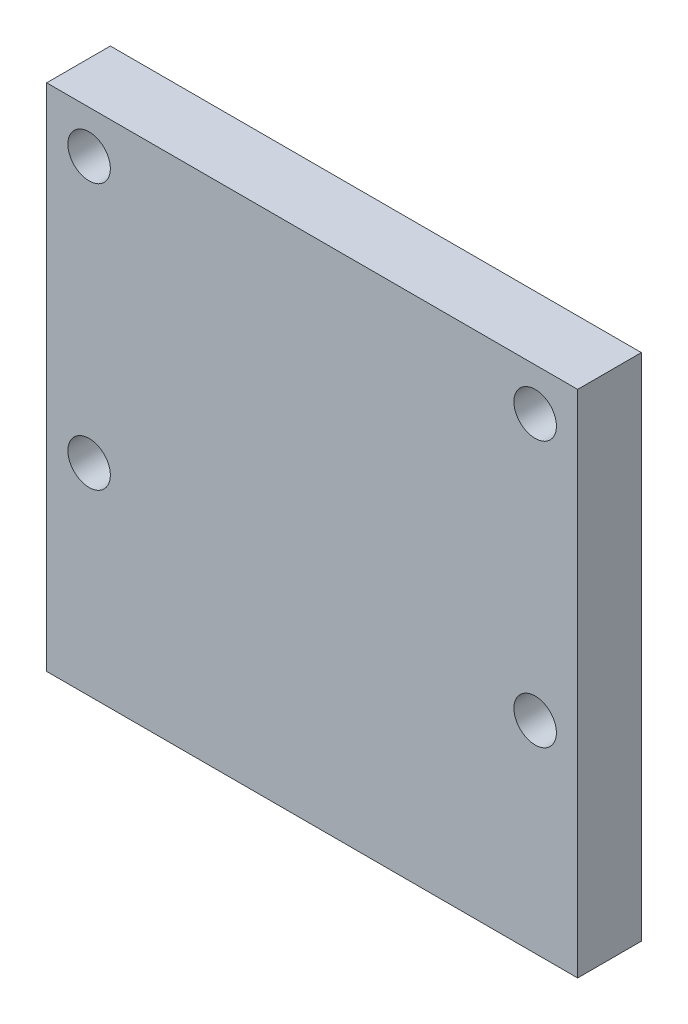
ISO-10303-21;
HEADER;
FILE_DESCRIPTION(('STEP AP214'),'2;1');
FILE_NAME('part.step','',(''),(''),'','','');
FILE_SCHEMA(('AUTOMOTIVE_DESIGN { 1 0 10303 214 1 1 1 1 }'));
ENDSEC;
DATA;
#1=APPLICATION_CONTEXT('core data for automotive mechanical design processes');
#2=APPLICATION_PROTOCOL_DEFINITION('international standard','automotive_design',2000,#1);
#3=PRODUCT_CONTEXT('',#1,'mechanical');
#4=PRODUCT('Part','Part','',(#3));
#5=PRODUCT_RELATED_PRODUCT_CATEGORY('part','',(#4));
#6=PRODUCT_DEFINITION_FORMATION('','',#4);
#7=PRODUCT_DEFINITION_CONTEXT('part definition',#1,'design');
#8=PRODUCT_DEFINITION('design','',#6,#7);
#9=PRODUCT_DEFINITION_SHAPE('','',#8);
#10=(LENGTH_UNIT() NAMED_UNIT(*) SI_UNIT(.MILLI.,.METRE.));
#11=(NAMED_UNIT(*) PLANE_ANGLE_UNIT() SI_UNIT($,.RADIAN.));
#12=(NAMED_UNIT(*) SI_UNIT($,.STERADIAN.) SOLID_ANGLE_UNIT());
#13=UNCERTAINTY_MEASURE_WITH_UNIT(LENGTH_MEASURE(1.E-05),#10,'distance_accuracy_value','');
#14=(GEOMETRIC_REPRESENTATION_CONTEXT(3) GLOBAL_UNCERTAINTY_ASSIGNED_CONTEXT((#13)) GLOBAL_UNIT_ASSIGNED_CONTEXT((#10,
#11,#12)) REPRESENTATION_CONTEXT('',''));
#15=CARTESIAN_POINT('',(0.,0.,0.));
#16=DIRECTION('',(0.,0.,1.));
#17=DIRECTION('',(1.,0.,0.));
#18=AXIS2_PLACEMENT_3D('',#15,#16,#17);
#19=CARTESIAN_POINT('',(-14.3954378335496,12.3161561050561,3.));
#20=DIRECTION('',(1.,0.,0.));
#21=DIRECTION('',(0.,0.,-1.));
#22=AXIS2_PLACEMENT_3D('',#19,#20,#21);
#23=PLANE('',#22);
#24=DIRECTION('',(0.,-1.,0.));
#25=VECTOR('',#24,1.);
#26=CARTESIAN_POINT('',(-14.3954378335496,12.3161561050561,0.));
#27=LINE('',#26,#25);
#28=CARTESIAN_POINT('',(-14.3954378335496,12.3161561050561,0.));
#29=VERTEX_POINT('',#28);
#30=CARTESIAN_POINT('',(-14.3954378335496,-11.6838438949439,0.));
#31=VERTEX_POINT('',#30);
#32=EDGE_CURVE('E107',#29,#31,#27,.T.);
#33=ORIENTED_EDGE('',*,*,#32,.T.);
#34=DIRECTION('',(0.,0.,-1.));
#35=VECTOR('',#34,1.);
#36=CARTESIAN_POINT('',(-14.3954378335496,-11.6838438949439,3.));
#37=LINE('',#36,#35);
#38=CARTESIAN_POINT('',(-14.3954378335496,-11.6838438949439,3.));
#39=VERTEX_POINT('',#38);
#40=EDGE_CURVE('E11',#39,#31,#37,.T.);
#41=ORIENTED_EDGE('',*,*,#40,.F.);
#42=DIRECTION('',(0.,-1.,0.));
#43=VECTOR('',#42,1.);
#44=CARTESIAN_POINT('',(-14.3954378335496,12.3161561050561,3.));
#45=LINE('',#44,#43);
#46=CARTESIAN_POINT('',(-14.3954378335496,12.3161561050561,3.));
#47=VERTEX_POINT('',#46);
#48=EDGE_CURVE('E94',#47,#39,#45,.T.);
#49=ORIENTED_EDGE('',*,*,#48,.F.);
#50=DIRECTION('',(0.,0.,-1.));
#51=VECTOR('',#50,1.);
#52=CARTESIAN_POINT('',(-14.3954378335496,12.3161561050561,3.));
#53=LINE('',#52,#51);
#54=EDGE_CURVE('E103',#47,#29,#53,.T.);
#55=ORIENTED_EDGE('',*,*,#54,.T.);
#56=EDGE_LOOP('',(#33,#41,#49,#55));
#57=FACE_BOUND('',#56,.T.);
#58=ADVANCED_FACE('F41',(#57),#23,.F.);
#59=CARTESIAN_POINT('',(-14.3954378335496,-11.6838438949439,3.));
#60=DIRECTION('',(0.,1.,0.));
#61=DIRECTION('',(0.,0.,1.));
#62=AXIS2_PLACEMENT_3D('',#59,#60,#61);
#63=PLANE('',#62);
#64=DIRECTION('',(1.,0.,0.));
#65=VECTOR('',#64,1.);
#66=CARTESIAN_POINT('',(-14.3954378335496,-11.6838438949439,0.));
#67=LINE('',#66,#65);
#68=CARTESIAN_POINT('',(10.6045621664504,-11.6838438949439,0.));
#69=VERTEX_POINT('',#68);
#70=EDGE_CURVE('E98',#31,#69,#67,.T.);
#71=ORIENTED_EDGE('',*,*,#70,.T.);
#72=DIRECTION('',(0.,0.,-1.));
#73=VECTOR('',#72,1.);
#74=CARTESIAN_POINT('',(10.6045621664504,-11.6838438949439,3.));
#75=LINE('',#74,#73);
#76=CARTESIAN_POINT('',(10.6045621664504,-11.6838438949439,3.));
#77=VERTEX_POINT('',#76);
#78=EDGE_CURVE('E50',#77,#69,#75,.T.);
#79=ORIENTED_EDGE('',*,*,#78,.F.);
#80=DIRECTION('',(1.,0.,0.));
#81=VECTOR('',#80,1.);
#82=CARTESIAN_POINT('',(-14.3954378335496,-11.6838438949439,3.));
#83=LINE('',#82,#81);
#84=EDGE_CURVE('E89',#39,#77,#83,.T.);
#85=ORIENTED_EDGE('',*,*,#84,.F.);
#86=ORIENTED_EDGE('',*,*,#40,.T.);
#87=EDGE_LOOP('',(#71,#79,#85,#86));
#88=FACE_BOUND('',#87,.T.);
#89=ADVANCED_FACE('F97',(#88),#63,.F.);
#90=CARTESIAN_POINT('',(10.6045621664504,12.3161561050561,3.));
#91=DIRECTION('',(-1.,0.,0.));
#92=DIRECTION('',(0.,-1.,0.));
#93=AXIS2_PLACEMENT_3D('',#90,#91,#92);
#94=PLANE('',#93);
#95=DIRECTION('',(0.,1.,0.));
#96=VECTOR('',#95,1.);
#97=CARTESIAN_POINT('',(10.6045621664504,12.3161561050561,0.));
#98=LINE('',#97,#96);
#99=CARTESIAN_POINT('',(10.6045621664504,12.3161561050561,0.));
#100=VERTEX_POINT('',#99);
#101=EDGE_CURVE('E76',#69,#100,#98,.T.);
#102=ORIENTED_EDGE('',*,*,#101,.T.);
#103=DIRECTION('',(0.,0.,-1.));
#104=VECTOR('',#103,1.);
#105=CARTESIAN_POINT('',(10.6045621664504,12.3161561050561,3.));
#106=LINE('',#105,#104);
#107=CARTESIAN_POINT('',(10.6045621664504,12.3161561050561,3.));
#108=VERTEX_POINT('',#107);
#109=EDGE_CURVE('E99',#108,#100,#106,.T.);
#110=ORIENTED_EDGE('',*,*,#109,.F.);
#111=DIRECTION('',(0.,1.,0.));
#112=VECTOR('',#111,1.);
#113=CARTESIAN_POINT('',(10.6045621664504,12.3161561050561,3.));
#114=LINE('',#113,#112);
#115=EDGE_CURVE('E92',#77,#108,#114,.T.);
#116=ORIENTED_EDGE('',*,*,#115,.F.);
#117=ORIENTED_EDGE('',*,*,#78,.T.);
#118=EDGE_LOOP('',(#102,#110,#116,#117));
#119=FACE_BOUND('',#118,.T.);
#120=ADVANCED_FACE('F101',(#119),#94,.F.);
#121=CARTESIAN_POINT('',(-14.3954378335496,12.3161561050561,3.));
#122=DIRECTION('',(0.,-1.,0.));
#123=DIRECTION('',(0.,0.,-1.));
#124=AXIS2_PLACEMENT_3D('',#121,#122,#123);
#125=PLANE('',#124);
#126=DIRECTION('',(-1.,0.,0.));
#127=VECTOR('',#126,1.);
#128=CARTESIAN_POINT('',(-14.3954378335496,12.3161561050561,0.));
#129=LINE('',#128,#127);
#130=EDGE_CURVE('E82',#100,#29,#129,.T.);
#131=ORIENTED_EDGE('',*,*,#130,.T.);
#132=ORIENTED_EDGE('',*,*,#54,.F.);
#133=DIRECTION('',(-1.,0.,0.));
#134=VECTOR('',#133,1.);
#135=CARTESIAN_POINT('',(-14.3954378335496,12.3161561050561,3.));
#136=LINE('',#135,#134);
#137=EDGE_CURVE('E59',#108,#47,#136,.T.);
#138=ORIENTED_EDGE('',*,*,#137,.F.);
#139=ORIENTED_EDGE('',*,*,#109,.T.);
#140=EDGE_LOOP('',(#131,#132,#138,#139));
#141=FACE_BOUND('',#140,.T.);
#142=ADVANCED_FACE('F145',(#141),#125,.F.);
#143=CARTESIAN_POINT('',(0.,0.,3.));
#144=DIRECTION('',(0.,0.,1.));
#145=DIRECTION('',(1.,0.,0.));
#146=AXIS2_PLACEMENT_3D('',#143,#144,#145);
#147=PLANE('',#146);
#148=CARTESIAN_POINT('',(-12.3954378335496,10.3161561050561,3.));
#149=DIRECTION('',(0.,0.,1.));
#150=DIRECTION('',(1.,0.,0.));
#151=AXIS2_PLACEMENT_3D('',#148,#149,#150);
#152=CIRCLE('',#151,0.999999999999989);
#153=CARTESIAN_POINT('',(-11.3954378335496,10.3161561050561,3.));
#154=VERTEX_POINT('',#153);
#155=EDGE_CURVE('E132',#154,#154,#152,.T.);
#156=ORIENTED_EDGE('',*,*,#155,.F.);
#157=EDGE_LOOP('',(#156));
#158=FACE_BOUND('',#157,.T.);
#159=CARTESIAN_POINT('',(8.6045621664504,10.3161561050561,3.));
#160=DIRECTION('',(0.,0.,1.));
#161=DIRECTION('',(1.,0.,0.));
#162=AXIS2_PLACEMENT_3D('',#159,#160,#161);
#163=CIRCLE('',#162,0.999999999999989);
#164=CARTESIAN_POINT('',(9.60456216645039,10.3161561050561,3.));
#165=VERTEX_POINT('',#164);
#166=EDGE_CURVE('E121',#165,#165,#163,.T.);
#167=ORIENTED_EDGE('',*,*,#166,.F.);
#168=EDGE_LOOP('',(#167));
#169=FACE_BOUND('',#168,.T.);
#170=CARTESIAN_POINT('',(-12.3954378335496,-2.18384389494392,3.));
#171=DIRECTION('',(0.,0.,1.));
#172=DIRECTION('',(1.,0.,0.));
#173=AXIS2_PLACEMENT_3D('',#170,#171,#172);
#174=CIRCLE('',#173,0.999999999999989);
#175=CARTESIAN_POINT('',(-11.3954378335496,-2.18384389494392,3.));
#176=VERTEX_POINT('',#175);
#177=EDGE_CURVE('E120',#176,#176,#174,.T.);
#178=ORIENTED_EDGE('',*,*,#177,.F.);
#179=EDGE_LOOP('',(#178));
#180=FACE_BOUND('',#179,.T.);
#181=CARTESIAN_POINT('',(8.6045621664504,-2.18384389494392,3.));
#182=DIRECTION('',(0.,0.,1.));
#183=DIRECTION('',(1.,0.,0.));
#184=AXIS2_PLACEMENT_3D('',#181,#182,#183);
#185=CIRCLE('',#184,0.999999999999989);
#186=CARTESIAN_POINT('',(9.60456216645039,-2.18384389494392,3.));
#187=VERTEX_POINT('',#186);
#188=EDGE_CURVE('E117',#187,#187,#185,.T.);
#189=ORIENTED_EDGE('',*,*,#188,.F.);
#190=EDGE_LOOP('',(#189));
#191=FACE_BOUND('',#190,.T.);
#192=ORIENTED_EDGE('',*,*,#48,.T.);
#193=ORIENTED_EDGE('',*,*,#84,.T.);
#194=ORIENTED_EDGE('',*,*,#115,.T.);
#195=ORIENTED_EDGE('',*,*,#137,.T.);
#196=EDGE_LOOP('',(#192,#193,#194,#195));
#197=FACE_BOUND('',#196,.T.);
#198=ADVANCED_FACE('F90',(#158,#169,#180,#191,#197),#147,.T.);
#199=CARTESIAN_POINT('',(0.,0.,0.));
#200=DIRECTION('',(0.,0.,1.));
#201=DIRECTION('',(1.,0.,0.));
#202=AXIS2_PLACEMENT_3D('',#199,#200,#201);
#203=PLANE('',#202);
#204=CARTESIAN_POINT('',(-12.3954378335496,10.3161561050561,0.));
#205=DIRECTION('',(0.,0.,1.));
#206=DIRECTION('',(1.,0.,0.));
#207=AXIS2_PLACEMENT_3D('',#204,#205,#206);
#208=CIRCLE('',#207,0.999999999999988);
#209=CARTESIAN_POINT('',(-11.3954378335496,10.3161561050561,0.));
#210=VERTEX_POINT('',#209);
#211=EDGE_CURVE('E44',#210,#210,#208,.T.);
#212=ORIENTED_EDGE('',*,*,#211,.T.);
#213=EDGE_LOOP('',(#212));
#214=FACE_BOUND('',#213,.T.);
#215=CARTESIAN_POINT('',(8.6045621664504,10.3161561050561,0.));
#216=DIRECTION('',(0.,0.,1.));
#217=DIRECTION('',(1.,0.,0.));
#218=AXIS2_PLACEMENT_3D('',#215,#216,#217);
#219=CIRCLE('',#218,0.999999999999988);
#220=CARTESIAN_POINT('',(9.60456216645039,10.3161561050561,0.));
#221=VERTEX_POINT('',#220);
#222=EDGE_CURVE('E118',#221,#221,#219,.T.);
#223=ORIENTED_EDGE('',*,*,#222,.T.);
#224=EDGE_LOOP('',(#223));
#225=FACE_BOUND('',#224,.T.);
#226=CARTESIAN_POINT('',(-12.3954378335496,-2.18384389494392,0.));
#227=DIRECTION('',(0.,0.,1.));
#228=DIRECTION('',(1.,0.,0.));
#229=AXIS2_PLACEMENT_3D('',#226,#227,#228);
#230=CIRCLE('',#229,0.999999999999988);
#231=CARTESIAN_POINT('',(-11.3954378335496,-2.18384389494392,0.));
#232=VERTEX_POINT('',#231);
#233=EDGE_CURVE('E125',#232,#232,#230,.T.);
#234=ORIENTED_EDGE('',*,*,#233,.T.);
#235=EDGE_LOOP('',(#234));
#236=FACE_BOUND('',#235,.T.);
#237=CARTESIAN_POINT('',(8.6045621664504,-2.18384389494392,0.));
#238=DIRECTION('',(0.,0.,1.));
#239=DIRECTION('',(1.,0.,0.));
#240=AXIS2_PLACEMENT_3D('',#237,#238,#239);
#241=CIRCLE('',#240,0.999999999999988);
#242=CARTESIAN_POINT('',(9.60456216645039,-2.18384389494392,0.));
#243=VERTEX_POINT('',#242);
#244=EDGE_CURVE('E110',#243,#243,#241,.T.);
#245=ORIENTED_EDGE('',*,*,#244,.T.);
#246=EDGE_LOOP('',(#245));
#247=FACE_BOUND('',#246,.T.);
#248=ORIENTED_EDGE('',*,*,#32,.F.);
#249=ORIENTED_EDGE('',*,*,#130,.F.);
#250=ORIENTED_EDGE('',*,*,#101,.F.);
#251=ORIENTED_EDGE('',*,*,#70,.F.);
#252=EDGE_LOOP('',(#248,#249,#250,#251));
#253=FACE_BOUND('',#252,.T.);
#254=ADVANCED_FACE('F144',(#214,#225,#236,#247,#253),#203,.F.);
#255=CARTESIAN_POINT('',(8.6045621664504,-2.18384389494392,3.));
#256=DIRECTION('',(0.,0.,1.));
#257=DIRECTION('',(1.,0.,0.));
#258=AXIS2_PLACEMENT_3D('',#255,#256,#257);
#259=CYLINDRICAL_SURFACE('',#258,0.999999999999988);
#260=ORIENTED_EDGE('',*,*,#188,.T.);
#261=EDGE_LOOP('',(#260));
#262=FACE_BOUND('',#261,.T.);
#263=ORIENTED_EDGE('',*,*,#244,.F.);
#264=EDGE_LOOP('',(#263));
#265=FACE_BOUND('',#264,.T.);
#266=ADVANCED_FACE('F140',(#262,#265),#259,.F.);
#267=CARTESIAN_POINT('',(-12.3954378335496,-2.18384389494392,3.));
#268=DIRECTION('',(0.,0.,1.));
#269=DIRECTION('',(1.,0.,0.));
#270=AXIS2_PLACEMENT_3D('',#267,#268,#269);
#271=CYLINDRICAL_SURFACE('',#270,0.999999999999988);
#272=ORIENTED_EDGE('',*,*,#177,.T.);
#273=EDGE_LOOP('',(#272));
#274=FACE_BOUND('',#273,.T.);
#275=ORIENTED_EDGE('',*,*,#233,.F.);
#276=EDGE_LOOP('',(#275));
#277=FACE_BOUND('',#276,.T.);
#278=ADVANCED_FACE('F196',(#274,#277),#271,.F.);
#279=CARTESIAN_POINT('',(8.6045621664504,10.3161561050561,3.));
#280=DIRECTION('',(0.,0.,1.));
#281=DIRECTION('',(1.,0.,0.));
#282=AXIS2_PLACEMENT_3D('',#279,#280,#281);
#283=CYLINDRICAL_SURFACE('',#282,0.999999999999988);
#284=ORIENTED_EDGE('',*,*,#166,.T.);
#285=EDGE_LOOP('',(#284));
#286=FACE_BOUND('',#285,.T.);
#287=ORIENTED_EDGE('',*,*,#222,.F.);
#288=EDGE_LOOP('',(#287));
#289=FACE_BOUND('',#288,.T.);
#290=ADVANCED_FACE('F204',(#286,#289),#283,.F.);
#291=CARTESIAN_POINT('',(-12.3954378335496,10.3161561050561,3.));
#292=DIRECTION('',(0.,0.,1.));
#293=DIRECTION('',(1.,0.,0.));
#294=AXIS2_PLACEMENT_3D('',#291,#292,#293);
#295=CYLINDRICAL_SURFACE('',#294,0.999999999999988);
#296=ORIENTED_EDGE('',*,*,#155,.T.);
#297=EDGE_LOOP('',(#296));
#298=FACE_BOUND('',#297,.T.);
#299=ORIENTED_EDGE('',*,*,#211,.F.);
#300=EDGE_LOOP('',(#299));
#301=FACE_BOUND('',#300,.T.);
#302=ADVANCED_FACE('F214',(#298,#301),#295,.F.);
#303=CLOSED_SHELL('',(#58,#89,#120,#142,#198,#254,#266,#278,#290,#302));
#304=MANIFOLD_SOLID_BREP('B2',#303);
#305=ADVANCED_BREP_SHAPE_REPRESENTATION('',(#18,#304),#14);
#306=SHAPE_DEFINITION_REPRESENTATION(#9,#305);
ENDSEC;
END-ISO-10303-21;
